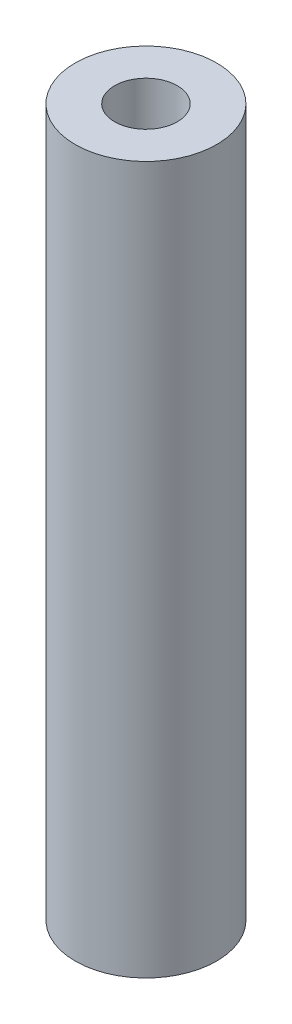
ISO-10303-21;
HEADER;
FILE_DESCRIPTION(('STEP AP214'),'2;1');
FILE_NAME('part.step','',(''),(''),'','','');
FILE_SCHEMA(('AUTOMOTIVE_DESIGN { 1 0 10303 214 1 1 1 1 }'));
ENDSEC;
DATA;
#1=APPLICATION_CONTEXT('core data for automotive mechanical design processes');
#2=APPLICATION_PROTOCOL_DEFINITION('international standard','automotive_design',2000,#1);
#3=PRODUCT_CONTEXT('',#1,'mechanical');
#4=PRODUCT('Part','Part','',(#3));
#5=PRODUCT_RELATED_PRODUCT_CATEGORY('part','',(#4));
#6=PRODUCT_DEFINITION_FORMATION('','',#4);
#7=PRODUCT_DEFINITION_CONTEXT('part definition',#1,'design');
#8=PRODUCT_DEFINITION('design','',#6,#7);
#9=PRODUCT_DEFINITION_SHAPE('','',#8);
#10=(LENGTH_UNIT() NAMED_UNIT(*) SI_UNIT(.MILLI.,.METRE.));
#11=(NAMED_UNIT(*) PLANE_ANGLE_UNIT() SI_UNIT($,.RADIAN.));
#12=(NAMED_UNIT(*) SI_UNIT($,.STERADIAN.) SOLID_ANGLE_UNIT());
#13=UNCERTAINTY_MEASURE_WITH_UNIT(LENGTH_MEASURE(1.E-05),#10,'distance_accuracy_value','');
#14=(GEOMETRIC_REPRESENTATION_CONTEXT(3) GLOBAL_UNCERTAINTY_ASSIGNED_CONTEXT((#13)) GLOBAL_UNIT_ASSIGNED_CONTEXT((#10,
#11,#12)) REPRESENTATION_CONTEXT('',''));
#15=CARTESIAN_POINT('',(0.,0.,0.));
#16=DIRECTION('',(0.,0.,1.));
#17=DIRECTION('',(1.,0.,0.));
#18=AXIS2_PLACEMENT_3D('',#15,#16,#17);
#19=CARTESIAN_POINT('',(0.,35.,0.));
#20=DIRECTION('',(0.,1.,0.));
#21=DIRECTION('',(0.,0.,1.));
#22=AXIS2_PLACEMENT_3D('',#19,#20,#21);
#23=PLANE('',#22);
#24=CARTESIAN_POINT('',(0.,35.,0.));
#25=DIRECTION('',(0.,1.,0.));
#26=DIRECTION('',(0.,0.,1.));
#27=AXIS2_PLACEMENT_3D('',#24,#25,#26);
#28=CIRCLE('',#27,3.5);
#29=CARTESIAN_POINT('',(0.,35.,3.5));
#30=VERTEX_POINT('',#29);
#31=EDGE_CURVE('E10',#30,#30,#28,.T.);
#32=ORIENTED_EDGE('',*,*,#31,.T.);
#33=EDGE_LOOP('',(#32));
#34=FACE_BOUND('',#33,.T.);
#35=CARTESIAN_POINT('',(0.,35.,0.));
#36=DIRECTION('',(0.,1.,0.));
#37=DIRECTION('',(0.,0.,1.));
#38=AXIS2_PLACEMENT_3D('',#35,#36,#37);
#39=CIRCLE('',#38,1.55);
#40=CARTESIAN_POINT('',(0.,35.,1.55));
#41=VERTEX_POINT('',#40);
#42=EDGE_CURVE('E50',#41,#41,#39,.T.);
#43=ORIENTED_EDGE('',*,*,#42,.F.);
#44=EDGE_LOOP('',(#43));
#45=FACE_BOUND('',#44,.T.);
#46=ADVANCED_FACE('F37',(#34,#45),#23,.T.);
#47=CARTESIAN_POINT('',(0.,0.,0.));
#48=DIRECTION('',(0.,1.,0.));
#49=DIRECTION('',(0.,0.,1.));
#50=AXIS2_PLACEMENT_3D('',#47,#48,#49);
#51=PLANE('',#50);
#52=CARTESIAN_POINT('',(0.,0.,0.));
#53=DIRECTION('',(0.,1.,0.));
#54=DIRECTION('',(0.,0.,1.));
#55=AXIS2_PLACEMENT_3D('',#52,#53,#54);
#56=CIRCLE('',#55,3.5);
#57=CARTESIAN_POINT('',(0.,0.,3.5));
#58=VERTEX_POINT('',#57);
#59=EDGE_CURVE('E41',#58,#58,#56,.T.);
#60=ORIENTED_EDGE('',*,*,#59,.F.);
#61=EDGE_LOOP('',(#60));
#62=FACE_BOUND('',#61,.T.);
#63=CARTESIAN_POINT('',(0.,0.,0.));
#64=DIRECTION('',(0.,1.,0.));
#65=DIRECTION('',(0.,0.,1.));
#66=AXIS2_PLACEMENT_3D('',#63,#64,#65);
#67=CIRCLE('',#66,1.55);
#68=CARTESIAN_POINT('',(0.,0.,1.55));
#69=VERTEX_POINT('',#68);
#70=EDGE_CURVE('E52',#69,#69,#67,.T.);
#71=ORIENTED_EDGE('',*,*,#70,.T.);
#72=EDGE_LOOP('',(#71));
#73=FACE_BOUND('',#72,.T.);
#74=ADVANCED_FACE('F64',(#62,#73),#51,.F.);
#75=CARTESIAN_POINT('',(0.,35.,0.));
#76=DIRECTION('',(0.,-1.,0.));
#77=DIRECTION('',(0.,0.,-1.));
#78=AXIS2_PLACEMENT_3D('',#75,#76,#77);
#79=CYLINDRICAL_SURFACE('',#78,3.5);
#80=ORIENTED_EDGE('',*,*,#31,.F.);
#81=EDGE_LOOP('',(#80));
#82=FACE_BOUND('',#81,.T.);
#83=ORIENTED_EDGE('',*,*,#59,.T.);
#84=EDGE_LOOP('',(#83));
#85=FACE_BOUND('',#84,.T.);
#86=ADVANCED_FACE('F39',(#82,#85),#79,.T.);
#87=CARTESIAN_POINT('',(0.,35.,0.));
#88=DIRECTION('',(0.,-1.,0.));
#89=DIRECTION('',(0.,0.,-1.));
#90=AXIS2_PLACEMENT_3D('',#87,#88,#89);
#91=CYLINDRICAL_SURFACE('',#90,1.55);
#92=ORIENTED_EDGE('',*,*,#42,.T.);
#93=EDGE_LOOP('',(#92));
#94=FACE_BOUND('',#93,.T.);
#95=ORIENTED_EDGE('',*,*,#70,.F.);
#96=EDGE_LOOP('',(#95));
#97=FACE_BOUND('',#96,.T.);
#98=ADVANCED_FACE('F60',(#94,#97),#91,.F.);
#99=CLOSED_SHELL('',(#46,#74,#86,#98));
#100=MANIFOLD_SOLID_BREP('B2',#99);
#101=ADVANCED_BREP_SHAPE_REPRESENTATION('',(#18,#100),#14);
#102=SHAPE_DEFINITION_REPRESENTATION(#9,#101);
ENDSEC;
END-ISO-10303-21;
